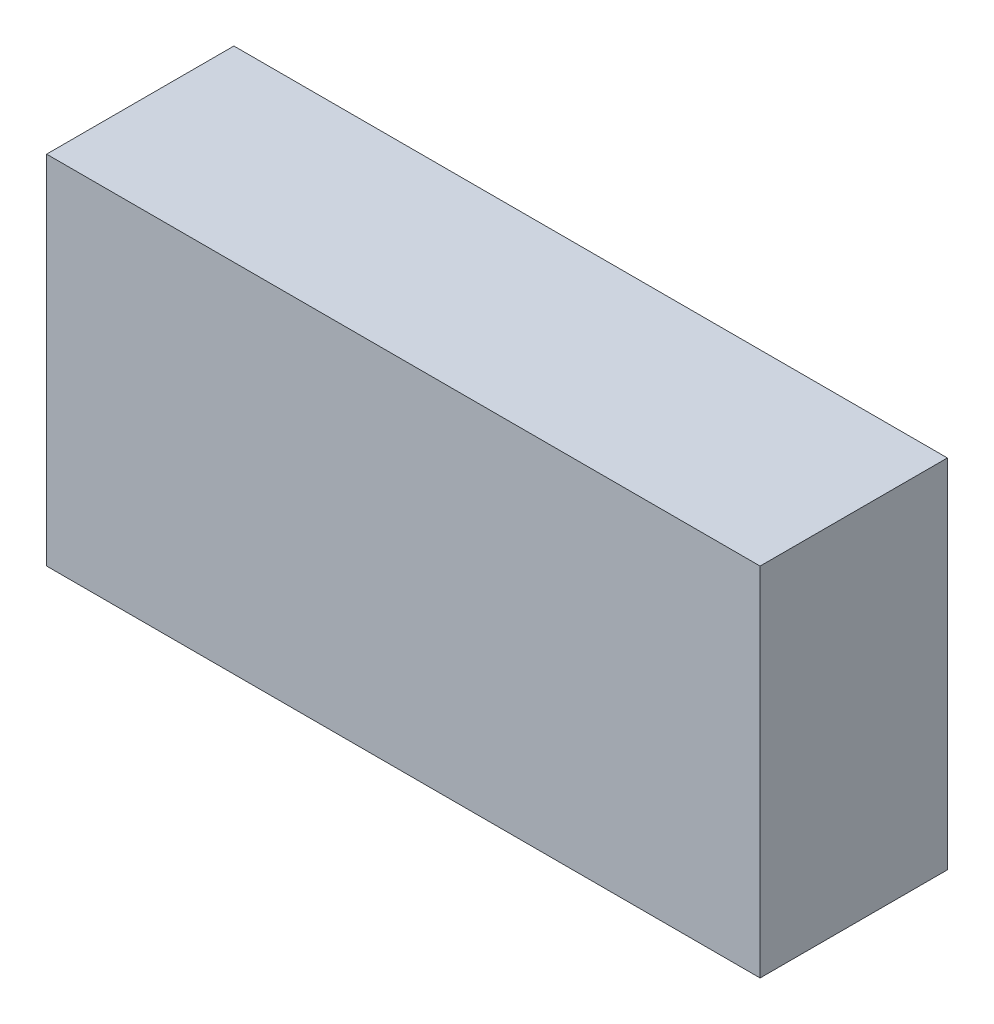
ISO-10303-21;
HEADER;
FILE_DESCRIPTION(('STEP AP214'),'2;1');
FILE_NAME('part.step','',(''),(''),'','','');
FILE_SCHEMA(('AUTOMOTIVE_DESIGN { 1 0 10303 214 1 1 1 1 }'));
ENDSEC;
DATA;
#1=APPLICATION_CONTEXT('core data for automotive mechanical design processes');
#2=APPLICATION_PROTOCOL_DEFINITION('international standard','automotive_design',2000,#1);
#3=PRODUCT_CONTEXT('',#1,'mechanical');
#4=PRODUCT('Part','Part','',(#3));
#5=PRODUCT_RELATED_PRODUCT_CATEGORY('part','',(#4));
#6=PRODUCT_DEFINITION_FORMATION('','',#4);
#7=PRODUCT_DEFINITION_CONTEXT('part definition',#1,'design');
#8=PRODUCT_DEFINITION('design','',#6,#7);
#9=PRODUCT_DEFINITION_SHAPE('','',#8);
#10=(LENGTH_UNIT() NAMED_UNIT(*) SI_UNIT(.MILLI.,.METRE.));
#11=(NAMED_UNIT(*) PLANE_ANGLE_UNIT() SI_UNIT($,.RADIAN.));
#12=(NAMED_UNIT(*) SI_UNIT($,.STERADIAN.) SOLID_ANGLE_UNIT());
#13=UNCERTAINTY_MEASURE_WITH_UNIT(LENGTH_MEASURE(1.E-05),#10,'distance_accuracy_value','');
#14=(GEOMETRIC_REPRESENTATION_CONTEXT(3) GLOBAL_UNCERTAINTY_ASSIGNED_CONTEXT((#13)) GLOBAL_UNIT_ASSIGNED_CONTEXT((#10,
#11,#12)) REPRESENTATION_CONTEXT('',''));
#15=CARTESIAN_POINT('',(0.,0.,0.));
#16=DIRECTION('',(0.,0.,1.));
#17=DIRECTION('',(1.,0.,0.));
#18=AXIS2_PLACEMENT_3D('',#15,#16,#17);
#19=CARTESIAN_POINT('',(-25.33722749763,15.1359954438135,1.05));
#20=DIRECTION('',(1.,0.,0.));
#21=DIRECTION('',(0.,0.,-1.));
#22=AXIS2_PLACEMENT_3D('',#19,#20,#21);
#23=PLANE('',#22);
#24=DIRECTION('',(0.,-1.,0.));
#25=VECTOR('',#24,1.);
#26=CARTESIAN_POINT('',(-25.33722749763,15.1359954438135,0.));
#27=LINE('',#26,#25);
#28=CARTESIAN_POINT('',(-25.33722749763,15.1359954438135,0.));
#29=VERTEX_POINT('',#28);
#30=CARTESIAN_POINT('',(-25.33722749763,13.1359954438135,0.));
#31=VERTEX_POINT('',#30);
#32=EDGE_CURVE('E107',#29,#31,#27,.T.);
#33=ORIENTED_EDGE('',*,*,#32,.T.);
#34=DIRECTION('',(0.,0.,-1.));
#35=VECTOR('',#34,1.);
#36=CARTESIAN_POINT('',(-25.33722749763,13.1359954438135,1.05));
#37=LINE('',#36,#35);
#38=CARTESIAN_POINT('',(-25.33722749763,13.1359954438135,1.05));
#39=VERTEX_POINT('',#38);
#40=EDGE_CURVE('E11',#39,#31,#37,.T.);
#41=ORIENTED_EDGE('',*,*,#40,.F.);
#42=DIRECTION('',(0.,-1.,0.));
#43=VECTOR('',#42,1.);
#44=CARTESIAN_POINT('',(-25.33722749763,15.1359954438135,1.05));
#45=LINE('',#44,#43);
#46=CARTESIAN_POINT('',(-25.33722749763,15.1359954438135,1.05));
#47=VERTEX_POINT('',#46);
#48=EDGE_CURVE('E91',#47,#39,#45,.T.);
#49=ORIENTED_EDGE('',*,*,#48,.F.);
#50=DIRECTION('',(0.,0.,-1.));
#51=VECTOR('',#50,1.);
#52=CARTESIAN_POINT('',(-25.33722749763,15.1359954438135,1.05));
#53=LINE('',#52,#51);
#54=EDGE_CURVE('E103',#47,#29,#53,.T.);
#55=ORIENTED_EDGE('',*,*,#54,.T.);
#56=EDGE_LOOP('',(#33,#41,#49,#55));
#57=FACE_BOUND('',#56,.T.);
#58=ADVANCED_FACE('F39',(#57),#23,.F.);
#59=CARTESIAN_POINT('',(-25.33722749763,13.1359954438135,1.05));
#60=DIRECTION('',(0.,1.,0.));
#61=DIRECTION('',(0.,0.,1.));
#62=AXIS2_PLACEMENT_3D('',#59,#60,#61);
#63=PLANE('',#62);
#64=DIRECTION('',(1.,0.,0.));
#65=VECTOR('',#64,1.);
#66=CARTESIAN_POINT('',(-25.33722749763,13.1359954438135,0.));
#67=LINE('',#66,#65);
#68=CARTESIAN_POINT('',(-21.33722749763,13.1359954438135,0.));
#69=VERTEX_POINT('',#68);
#70=EDGE_CURVE('E96',#31,#69,#67,.T.);
#71=ORIENTED_EDGE('',*,*,#70,.T.);
#72=DIRECTION('',(0.,0.,-1.));
#73=VECTOR('',#72,1.);
#74=CARTESIAN_POINT('',(-21.33722749763,13.1359954438135,1.05));
#75=LINE('',#74,#73);
#76=CARTESIAN_POINT('',(-21.33722749763,13.1359954438135,1.05));
#77=VERTEX_POINT('',#76);
#78=EDGE_CURVE('E48',#77,#69,#75,.T.);
#79=ORIENTED_EDGE('',*,*,#78,.F.);
#80=DIRECTION('',(1.,0.,0.));
#81=VECTOR('',#80,1.);
#82=CARTESIAN_POINT('',(-25.33722749763,13.1359954438135,1.05));
#83=LINE('',#82,#81);
#84=EDGE_CURVE('E86',#39,#77,#83,.T.);
#85=ORIENTED_EDGE('',*,*,#84,.F.);
#86=ORIENTED_EDGE('',*,*,#40,.T.);
#87=EDGE_LOOP('',(#71,#79,#85,#86));
#88=FACE_BOUND('',#87,.T.);
#89=ADVANCED_FACE('F95',(#88),#63,.F.);
#90=CARTESIAN_POINT('',(-21.33722749763,15.1359954438135,1.05));
#91=DIRECTION('',(-1.,0.,0.));
#92=DIRECTION('',(0.,0.,1.));
#93=AXIS2_PLACEMENT_3D('',#90,#91,#92);
#94=PLANE('',#93);
#95=DIRECTION('',(0.,1.,0.));
#96=VECTOR('',#95,1.);
#97=CARTESIAN_POINT('',(-21.33722749763,15.1359954438135,0.));
#98=LINE('',#97,#96);
#99=CARTESIAN_POINT('',(-21.33722749763,15.1359954438135,0.));
#100=VERTEX_POINT('',#99);
#101=EDGE_CURVE('E73',#69,#100,#98,.T.);
#102=ORIENTED_EDGE('',*,*,#101,.T.);
#103=DIRECTION('',(0.,0.,-1.));
#104=VECTOR('',#103,1.);
#105=CARTESIAN_POINT('',(-21.33722749763,15.1359954438135,1.05));
#106=LINE('',#105,#104);
#107=CARTESIAN_POINT('',(-21.33722749763,15.1359954438135,1.05));
#108=VERTEX_POINT('',#107);
#109=EDGE_CURVE('E98',#108,#100,#106,.T.);
#110=ORIENTED_EDGE('',*,*,#109,.F.);
#111=DIRECTION('',(0.,1.,0.));
#112=VECTOR('',#111,1.);
#113=CARTESIAN_POINT('',(-21.33722749763,15.1359954438135,1.05));
#114=LINE('',#113,#112);
#115=EDGE_CURVE('E89',#77,#108,#114,.T.);
#116=ORIENTED_EDGE('',*,*,#115,.F.);
#117=ORIENTED_EDGE('',*,*,#78,.T.);
#118=EDGE_LOOP('',(#102,#110,#116,#117));
#119=FACE_BOUND('',#118,.T.);
#120=ADVANCED_FACE('F99',(#119),#94,.F.);
#121=CARTESIAN_POINT('',(-25.33722749763,15.1359954438135,1.05));
#122=DIRECTION('',(0.,-1.,0.));
#123=DIRECTION('',(0.,0.,-1.));
#124=AXIS2_PLACEMENT_3D('',#121,#122,#123);
#125=PLANE('',#124);
#126=DIRECTION('',(-1.,0.,0.));
#127=VECTOR('',#126,1.);
#128=CARTESIAN_POINT('',(-25.33722749763,15.1359954438135,0.));
#129=LINE('',#128,#127);
#130=EDGE_CURVE('E79',#100,#29,#129,.T.);
#131=ORIENTED_EDGE('',*,*,#130,.T.);
#132=ORIENTED_EDGE('',*,*,#54,.F.);
#133=DIRECTION('',(-1.,0.,0.));
#134=VECTOR('',#133,1.);
#135=CARTESIAN_POINT('',(-25.33722749763,15.1359954438135,1.05));
#136=LINE('',#135,#134);
#137=EDGE_CURVE('E56',#108,#47,#136,.T.);
#138=ORIENTED_EDGE('',*,*,#137,.F.);
#139=ORIENTED_EDGE('',*,*,#109,.T.);
#140=EDGE_LOOP('',(#131,#132,#138,#139));
#141=FACE_BOUND('',#140,.T.);
#142=ADVANCED_FACE('F120',(#141),#125,.F.);
#143=CARTESIAN_POINT('',(0.,0.,1.05));
#144=DIRECTION('',(0.,0.,1.));
#145=DIRECTION('',(1.,0.,0.));
#146=AXIS2_PLACEMENT_3D('',#143,#144,#145);
#147=PLANE('',#146);
#148=ORIENTED_EDGE('',*,*,#48,.T.);
#149=ORIENTED_EDGE('',*,*,#84,.T.);
#150=ORIENTED_EDGE('',*,*,#115,.T.);
#151=ORIENTED_EDGE('',*,*,#137,.T.);
#152=EDGE_LOOP('',(#148,#149,#150,#151));
#153=FACE_BOUND('',#152,.T.);
#154=ADVANCED_FACE('F87',(#153),#147,.T.);
#155=CARTESIAN_POINT('',(0.,0.,0.));
#156=DIRECTION('',(0.,0.,1.));
#157=DIRECTION('',(1.,0.,0.));
#158=AXIS2_PLACEMENT_3D('',#155,#156,#157);
#159=PLANE('',#158);
#160=ORIENTED_EDGE('',*,*,#32,.F.);
#161=ORIENTED_EDGE('',*,*,#130,.F.);
#162=ORIENTED_EDGE('',*,*,#101,.F.);
#163=ORIENTED_EDGE('',*,*,#70,.F.);
#164=EDGE_LOOP('',(#160,#161,#162,#163));
#165=FACE_BOUND('',#164,.T.);
#166=ADVANCED_FACE('F123',(#165),#159,.F.);
#167=CLOSED_SHELL('',(#58,#89,#120,#142,#154,#166));
#168=MANIFOLD_SOLID_BREP('B2',#167);
#169=ADVANCED_BREP_SHAPE_REPRESENTATION('',(#18,#168),#14);
#170=SHAPE_DEFINITION_REPRESENTATION(#9,#169);
ENDSEC;
END-ISO-10303-21;
